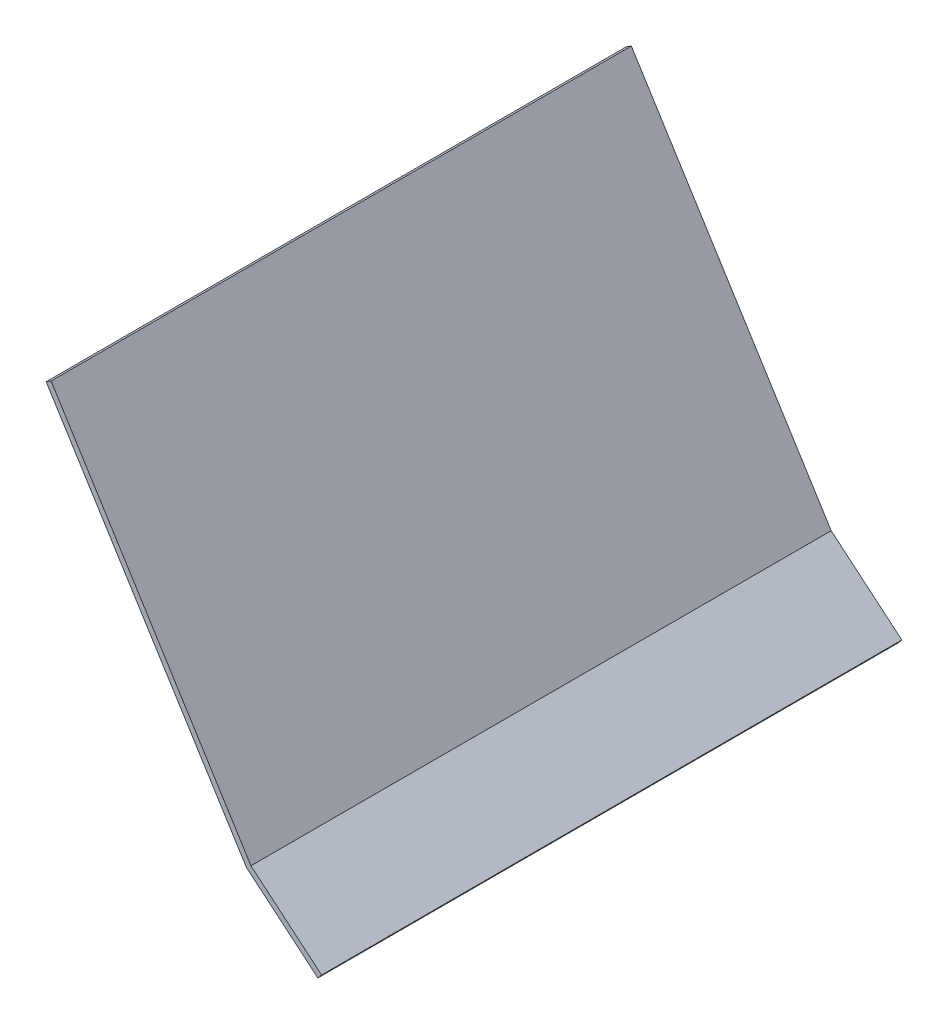
ISO-10303-21;
HEADER;
FILE_DESCRIPTION(('STEP AP214'),'2;1');
FILE_NAME('part.step','',(''),(''),'','','');
FILE_SCHEMA(('AUTOMOTIVE_DESIGN { 1 0 10303 214 1 1 1 1 }'));
ENDSEC;
DATA;
#1=APPLICATION_CONTEXT('core data for automotive mechanical design processes');
#2=APPLICATION_PROTOCOL_DEFINITION('international standard','automotive_design',2000,#1);
#3=PRODUCT_CONTEXT('',#1,'mechanical');
#4=PRODUCT('Part','Part','',(#3));
#5=PRODUCT_RELATED_PRODUCT_CATEGORY('part','',(#4));
#6=PRODUCT_DEFINITION_FORMATION('','',#4);
#7=PRODUCT_DEFINITION_CONTEXT('part definition',#1,'design');
#8=PRODUCT_DEFINITION('design','',#6,#7);
#9=PRODUCT_DEFINITION_SHAPE('','',#8);
#10=(LENGTH_UNIT() NAMED_UNIT(*) SI_UNIT(.MILLI.,.METRE.));
#11=(NAMED_UNIT(*) PLANE_ANGLE_UNIT() SI_UNIT($,.RADIAN.));
#12=(NAMED_UNIT(*) SI_UNIT($,.STERADIAN.) SOLID_ANGLE_UNIT());
#13=UNCERTAINTY_MEASURE_WITH_UNIT(LENGTH_MEASURE(1.E-05),#10,'distance_accuracy_value','');
#14=(GEOMETRIC_REPRESENTATION_CONTEXT(3) GLOBAL_UNCERTAINTY_ASSIGNED_CONTEXT((#13)) GLOBAL_UNIT_ASSIGNED_CONTEXT((#10,
#11,#12)) REPRESENTATION_CONTEXT('',''));
#15=CARTESIAN_POINT('',(0.,0.,0.));
#16=DIRECTION('',(0.,0.,1.));
#17=DIRECTION('',(1.,0.,0.));
#18=AXIS2_PLACEMENT_3D('',#15,#16,#17);
#19=CARTESIAN_POINT('',(-9.82840506945594,4.57093340619143,-100.));
#20=DIRECTION('',(0.766044443118977,-0.642787609686541,0.));
#21=DIRECTION('',(0.642787609686541,0.766044443118977,0.));
#22=AXIS2_PLACEMENT_3D('',#19,#20,#21);
#23=PLANE('',#22);
#24=DIRECTION('',(0.642787609686541,0.766044443118976,0.));
#25=VECTOR('',#24,1.);
#26=CARTESIAN_POINT('',(-9.82840506945594,4.57093340619143,0.));
#27=LINE('',#26,#25);
#28=CARTESIAN_POINT('',(-9.82840506945594,4.57093340619143,0.));
#29=VERTEX_POINT('',#28);
#30=CARTESIAN_POINT('',(-9.1856174597694,5.33697784931041,0.));
#31=VERTEX_POINT('',#30);
#32=EDGE_CURVE('E130',#29,#31,#27,.T.);
#33=ORIENTED_EDGE('',*,*,#32,.F.);
#34=DIRECTION('',(0.,0.,1.));
#35=VECTOR('',#34,1.);
#36=CARTESIAN_POINT('',(-9.82840506945594,4.57093340619143,-100.));
#37=LINE('',#36,#35);
#38=CARTESIAN_POINT('',(-9.82840506945594,4.57093340619143,-100.));
#39=VERTEX_POINT('',#38);
#40=EDGE_CURVE('E11',#39,#29,#37,.T.);
#41=ORIENTED_EDGE('',*,*,#40,.F.);
#42=DIRECTION('',(0.642787609686541,0.766044443118976,0.));
#43=VECTOR('',#42,1.);
#44=CARTESIAN_POINT('',(-9.82840506945594,4.57093340619143,-100.));
#45=LINE('',#44,#43);
#46=CARTESIAN_POINT('',(-9.1856174597694,5.33697784931041,-100.));
#47=VERTEX_POINT('',#46);
#48=EDGE_CURVE('E150',#39,#47,#45,.T.);
#49=ORIENTED_EDGE('',*,*,#48,.T.);
#50=DIRECTION('',(0.,0.,1.));
#51=VECTOR('',#50,1.);
#52=CARTESIAN_POINT('',(-9.1856174597694,5.33697784931041,-100.));
#53=LINE('',#52,#51);
#54=EDGE_CURVE('E42',#47,#31,#53,.T.);
#55=ORIENTED_EDGE('',*,*,#54,.T.);
#56=EDGE_LOOP('',(#33,#41,#49,#55));
#57=FACE_BOUND('',#56,.T.);
#58=ADVANCED_FACE('F39',(#57),#23,.T.);
#59=CARTESIAN_POINT('',(-9.82840506945594,4.57093340619143,-100.));
#60=DIRECTION('',(-0.642787609686541,-0.766044443118977,0.));
#61=DIRECTION('',(0.766044443118977,-0.642787609686541,0.));
#62=AXIS2_PLACEMENT_3D('',#59,#60,#61);
#63=PLANE('',#62);
#64=DIRECTION('',(0.766044443118977,-0.642787609686541,0.));
#65=VECTOR('',#64,1.);
#66=CARTESIAN_POINT('',(-9.82840506945594,4.57093340619143,0.));
#67=LINE('',#66,#65);
#68=CARTESIAN_POINT('',(-22.126818959438,14.8905279653409,0.));
#69=VERTEX_POINT('',#68);
#70=EDGE_CURVE('E147',#69,#29,#67,.T.);
#71=ORIENTED_EDGE('',*,*,#70,.F.);
#72=DIRECTION('',(0.,0.,1.));
#73=VECTOR('',#72,1.);
#74=CARTESIAN_POINT('',(-22.126818959438,14.8905279653409,-100.));
#75=LINE('',#74,#73);
#76=CARTESIAN_POINT('',(-22.126818959438,14.8905279653409,-100.));
#77=VERTEX_POINT('',#76);
#78=EDGE_CURVE('E49',#77,#69,#75,.T.);
#79=ORIENTED_EDGE('',*,*,#78,.F.);
#80=DIRECTION('',(0.766044443118977,-0.642787609686541,0.));
#81=VECTOR('',#80,1.);
#82=CARTESIAN_POINT('',(-9.82840506945594,4.57093340619143,-100.));
#83=LINE('',#82,#81);
#84=EDGE_CURVE('E115',#77,#39,#83,.T.);
#85=ORIENTED_EDGE('',*,*,#84,.T.);
#86=ORIENTED_EDGE('',*,*,#40,.T.);
#87=EDGE_LOOP('',(#71,#79,#85,#86));
#88=FACE_BOUND('',#87,.T.);
#89=ADVANCED_FACE('F162',(#88),#63,.T.);
#90=CARTESIAN_POINT('',(-22.126818959438,14.8905279653409,-100.));
#91=DIRECTION('',(-0.848048096156428,-0.529919264233202,0.));
#92=DIRECTION('',(0.529919264233202,-0.848048096156428,0.));
#93=AXIS2_PLACEMENT_3D('',#90,#91,#92);
#94=PLANE('',#93);
#95=DIRECTION('',(0.529919264233202,-0.848048096156428,0.));
#96=VECTOR('',#95,1.);
#97=CARTESIAN_POINT('',(-22.126818959438,14.8905279653409,0.));
#98=LINE('',#97,#96);
#99=CARTESIAN_POINT('',(-56.6555021006789,70.1479718385867,0.));
#100=VERTEX_POINT('',#99);
#101=EDGE_CURVE('E101',#100,#69,#98,.T.);
#102=ORIENTED_EDGE('',*,*,#101,.F.);
#103=DIRECTION('',(0.,0.,1.));
#104=VECTOR('',#103,1.);
#105=CARTESIAN_POINT('',(-56.6555021006789,70.1479718385867,-100.));
#106=LINE('',#105,#104);
#107=CARTESIAN_POINT('',(-56.6555021006789,70.1479718385867,-100.));
#108=VERTEX_POINT('',#107);
#109=EDGE_CURVE('E97',#108,#100,#106,.T.);
#110=ORIENTED_EDGE('',*,*,#109,.F.);
#111=DIRECTION('',(0.529919264233203,-0.848048096156428,0.));
#112=VECTOR('',#111,1.);
#113=CARTESIAN_POINT('',(-31.5682649574274,30.,-100.));
#114=LINE('',#113,#112);
#115=EDGE_CURVE('E100',#108,#77,#114,.T.);
#116=ORIENTED_EDGE('',*,*,#115,.T.);
#117=ORIENTED_EDGE('',*,*,#78,.T.);
#118=EDGE_LOOP('',(#102,#110,#116,#117));
#119=FACE_BOUND('',#118,.T.);
#120=ADVANCED_FACE('F99',(#119),#94,.T.);
#121=CARTESIAN_POINT('',(-56.6555021006789,70.1479718385867,-100.));
#122=DIRECTION('',(-0.529919264233204,0.848048096156427,0.));
#123=DIRECTION('',(-0.848048096156427,-0.529919264233204,0.));
#124=AXIS2_PLACEMENT_3D('',#121,#122,#123);
#125=PLANE('',#124);
#126=DIRECTION('',(-0.848048096156427,-0.529919264233204,0.));
#127=VECTOR('',#126,1.);
#128=CARTESIAN_POINT('',(-56.6555021006789,70.1479718385867,0.));
#129=LINE('',#128,#127);
#130=CARTESIAN_POINT('',(-55.8074540045224,70.6778911028199,0.));
#131=VERTEX_POINT('',#130);
#132=EDGE_CURVE('E142',#131,#100,#129,.T.);
#133=ORIENTED_EDGE('',*,*,#132,.F.);
#134=DIRECTION('',(0.,0.,1.));
#135=VECTOR('',#134,1.);
#136=CARTESIAN_POINT('',(-55.8074540045224,70.6778911028199,-100.));
#137=LINE('',#136,#135);
#138=CARTESIAN_POINT('',(-55.8074540045224,70.6778911028199,-100.));
#139=VERTEX_POINT('',#138);
#140=EDGE_CURVE('E107',#139,#131,#137,.T.);
#141=ORIENTED_EDGE('',*,*,#140,.F.);
#142=DIRECTION('',(-0.848048096156427,-0.529919264233204,0.));
#143=VECTOR('',#142,1.);
#144=CARTESIAN_POINT('',(-56.6555021006789,70.1479718385867,-100.));
#145=LINE('',#144,#143);
#146=EDGE_CURVE('E114',#139,#108,#145,.T.);
#147=ORIENTED_EDGE('',*,*,#146,.T.);
#148=ORIENTED_EDGE('',*,*,#109,.T.);
#149=EDGE_LOOP('',(#133,#141,#147,#148));
#150=FACE_BOUND('',#149,.T.);
#151=ADVANCED_FACE('F119',(#150),#125,.T.);
#152=CARTESIAN_POINT('',(-30.720216861271,30.5299192642332,-100.));
#153=DIRECTION('',(0.848048096156428,0.529919264233202,0.));
#154=DIRECTION('',(-0.529919264233202,0.848048096156428,0.));
#155=AXIS2_PLACEMENT_3D('',#152,#153,#154);
#156=PLANE('',#155);
#157=DIRECTION('',(-0.529919264233202,0.848048096156428,0.));
#158=VECTOR('',#157,1.);
#159=CARTESIAN_POINT('',(-30.720216861271,30.5299192642332,0.));
#160=LINE('',#159,#158);
#161=CARTESIAN_POINT('',(-21.3627018293643,15.5547648526521,0.));
#162=VERTEX_POINT('',#161);
#163=EDGE_CURVE('E138',#162,#131,#160,.T.);
#164=ORIENTED_EDGE('',*,*,#163,.F.);
#165=DIRECTION('',(0.,0.,1.));
#166=VECTOR('',#165,1.);
#167=CARTESIAN_POINT('',(-21.3627018293643,15.5547648526521,-100.));
#168=LINE('',#167,#166);
#169=CARTESIAN_POINT('',(-21.3627018293643,15.5547648526521,-100.));
#170=VERTEX_POINT('',#169);
#171=EDGE_CURVE('E155',#170,#162,#168,.T.);
#172=ORIENTED_EDGE('',*,*,#171,.F.);
#173=DIRECTION('',(-0.529919264233203,0.848048096156427,0.));
#174=VECTOR('',#173,1.);
#175=CARTESIAN_POINT('',(-21.3627018293643,15.5547648526521,-100.));
#176=LINE('',#175,#174);
#177=EDGE_CURVE('E121',#170,#139,#176,.T.);
#178=ORIENTED_EDGE('',*,*,#177,.T.);
#179=ORIENTED_EDGE('',*,*,#140,.T.);
#180=EDGE_LOOP('',(#164,#172,#178,#179));
#181=FACE_BOUND('',#180,.T.);
#182=ADVANCED_FACE('F175',(#181),#156,.T.);
#183=CARTESIAN_POINT('',(-9.1856174597694,5.33697784931041,-100.));
#184=DIRECTION('',(0.642787609686541,0.766044443118977,0.));
#185=DIRECTION('',(-0.766044443118977,0.642787609686541,0.));
#186=AXIS2_PLACEMENT_3D('',#183,#184,#185);
#187=PLANE('',#186);
#188=DIRECTION('',(-0.766044443118977,0.642787609686541,0.));
#189=VECTOR('',#188,1.);
#190=CARTESIAN_POINT('',(-9.1856174597694,5.33697784931041,0.));
#191=LINE('',#190,#189);
#192=EDGE_CURVE('E134',#31,#162,#191,.T.);
#193=ORIENTED_EDGE('',*,*,#192,.F.);
#194=ORIENTED_EDGE('',*,*,#54,.F.);
#195=DIRECTION('',(-0.766044443118977,0.642787609686541,0.));
#196=VECTOR('',#195,1.);
#197=CARTESIAN_POINT('',(-9.1856174597694,5.33697784931041,-100.));
#198=LINE('',#197,#196);
#199=EDGE_CURVE('E124',#47,#170,#198,.T.);
#200=ORIENTED_EDGE('',*,*,#199,.T.);
#201=ORIENTED_EDGE('',*,*,#171,.T.);
#202=EDGE_LOOP('',(#193,#194,#200,#201));
#203=FACE_BOUND('',#202,.T.);
#204=ADVANCED_FACE('F159',(#203),#187,.T.);
#205=CARTESIAN_POINT('',(0.,0.,-100.));
#206=DIRECTION('',(0.,0.,1.));
#207=DIRECTION('',(1.,0.,0.));
#208=AXIS2_PLACEMENT_3D('',#205,#206,#207);
#209=PLANE('',#208);
#210=ORIENTED_EDGE('',*,*,#48,.F.);
#211=ORIENTED_EDGE('',*,*,#84,.F.);
#212=ORIENTED_EDGE('',*,*,#115,.F.);
#213=ORIENTED_EDGE('',*,*,#146,.F.);
#214=ORIENTED_EDGE('',*,*,#177,.F.);
#215=ORIENTED_EDGE('',*,*,#199,.F.);
#216=EDGE_LOOP('',(#210,#211,#212,#213,#214,#215));
#217=FACE_BOUND('',#216,.T.);
#218=ADVANCED_FACE('F112',(#217),#209,.F.);
#219=CARTESIAN_POINT('',(0.,0.,0.));
#220=DIRECTION('',(0.,0.,1.));
#221=DIRECTION('',(1.,0.,0.));
#222=AXIS2_PLACEMENT_3D('',#219,#220,#221);
#223=PLANE('',#222);
#224=ORIENTED_EDGE('',*,*,#32,.T.);
#225=ORIENTED_EDGE('',*,*,#192,.T.);
#226=ORIENTED_EDGE('',*,*,#163,.T.);
#227=ORIENTED_EDGE('',*,*,#132,.T.);
#228=ORIENTED_EDGE('',*,*,#101,.T.);
#229=ORIENTED_EDGE('',*,*,#70,.T.);
#230=EDGE_LOOP('',(#224,#225,#226,#227,#228,#229));
#231=FACE_BOUND('',#230,.T.);
#232=ADVANCED_FACE('F161',(#231),#223,.T.);
#233=CLOSED_SHELL('',(#58,#89,#120,#151,#182,#204,#218,#232));
#234=MANIFOLD_SOLID_BREP('B2',#233);
#235=ADVANCED_BREP_SHAPE_REPRESENTATION('',(#18,#234),#14);
#236=SHAPE_DEFINITION_REPRESENTATION(#9,#235);
ENDSEC;
END-ISO-10303-21;
